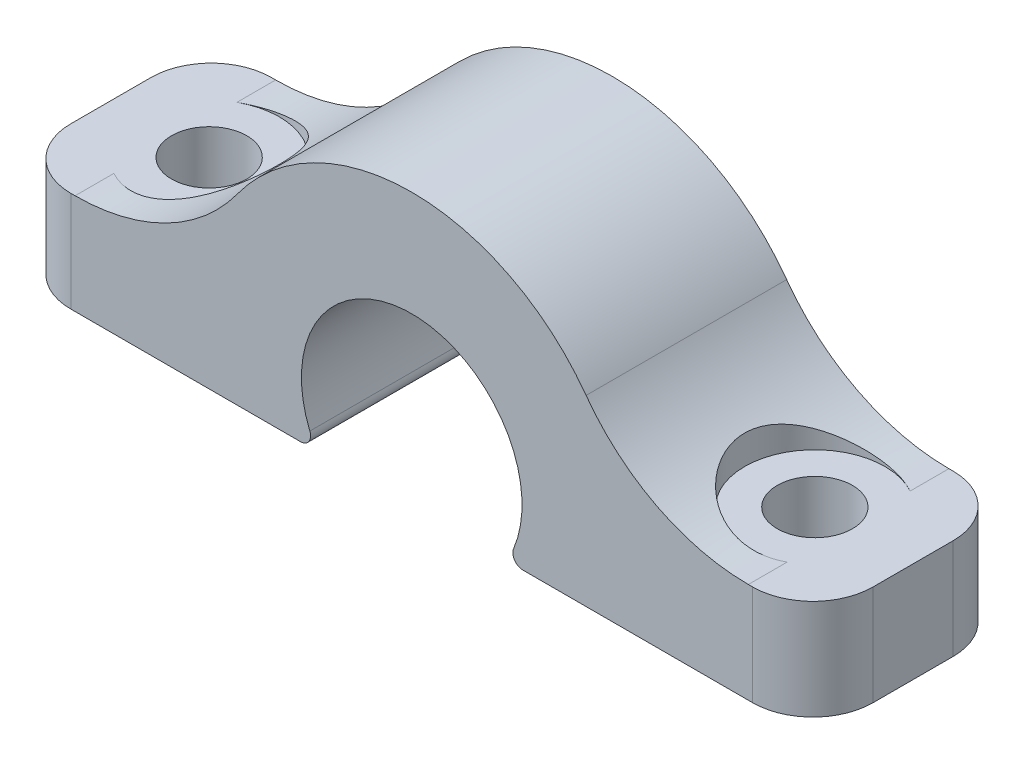
ISO-10303-21;
HEADER;
FILE_DESCRIPTION(('STEP AP214'),'2;1');
FILE_NAME('part.step','',(''),(''),'','','');
FILE_SCHEMA(('AUTOMOTIVE_DESIGN { 1 0 10303 214 1 1 1 1 }'));
ENDSEC;
DATA;
#1=APPLICATION_CONTEXT('core data for automotive mechanical design processes');
#2=APPLICATION_PROTOCOL_DEFINITION('international standard','automotive_design',2000,#1);
#3=PRODUCT_CONTEXT('',#1,'mechanical');
#4=PRODUCT('Part','Part','',(#3));
#5=PRODUCT_RELATED_PRODUCT_CATEGORY('part','',(#4));
#6=PRODUCT_DEFINITION_FORMATION('','',#4);
#7=PRODUCT_DEFINITION_CONTEXT('part definition',#1,'design');
#8=PRODUCT_DEFINITION('design','',#6,#7);
#9=PRODUCT_DEFINITION_SHAPE('','',#8);
#10=(LENGTH_UNIT() NAMED_UNIT(*) SI_UNIT(.MILLI.,.METRE.));
#11=(NAMED_UNIT(*) PLANE_ANGLE_UNIT() SI_UNIT($,.RADIAN.));
#12=(NAMED_UNIT(*) SI_UNIT($,.STERADIAN.) SOLID_ANGLE_UNIT());
#13=UNCERTAINTY_MEASURE_WITH_UNIT(LENGTH_MEASURE(1.E-05),#10,'distance_accuracy_value','');
#14=(GEOMETRIC_REPRESENTATION_CONTEXT(3) GLOBAL_UNCERTAINTY_ASSIGNED_CONTEXT((#13)) GLOBAL_UNIT_ASSIGNED_CONTEXT((#10,
#11,#12)) REPRESENTATION_CONTEXT('',''));
#15=CARTESIAN_POINT('',(0.,0.,0.));
#16=DIRECTION('',(0.,0.,1.));
#17=DIRECTION('',(1.,0.,0.));
#18=AXIS2_PLACEMENT_3D('',#15,#16,#17);
#19=CARTESIAN_POINT('',(16.7845911478356,15.,-5.));
#20=DIRECTION('',(0.,0.,1.));
#21=DIRECTION('',(1.,0.,0.));
#22=AXIS2_PLACEMENT_3D('',#19,#20,#21);
#23=CYLINDRICAL_SURFACE('',#22,10.);
#24=CARTESIAN_POINT('',(15.1,5.14291358135508,-3.5));
#25=CARTESIAN_POINT('',(14.9012420637391,5.17688479222685,-3.49999725385385));
#26=CARTESIAN_POINT('',(14.7035010704678,5.21692465445986,-3.48301079526282));
#27=CARTESIAN_POINT('',(14.3159783813763,5.30744431259501,-3.41672625102483));
#28=CARTESIAN_POINT('',(14.1262013235219,5.35793009313172,-3.36740960761945));
#29=CARTESIAN_POINT('',(13.7600779883335,5.46644439182743,-3.23915507273451));
#30=CARTESIAN_POINT('',(13.5836893492142,5.524447400026,-3.16031573129746));
#31=CARTESIAN_POINT('',(13.2473151107082,5.64480754116417,-2.97563318130559));
#32=CARTESIAN_POINT('',(13.0873328562993,5.7071655576753,-2.86978448129429));
#33=CARTESIAN_POINT('',(12.7778502746989,5.83616918616985,-2.62653217658595));
#34=CARTESIAN_POINT('',(12.6295496028122,5.90284812309209,-2.48761964016044));
#35=CARTESIAN_POINT('',(12.3581779950725,6.03175303369091,-2.18487609142455));
#36=CARTESIAN_POINT('',(12.2351179471765,6.09397707817443,-2.02103437836355));
#37=CARTESIAN_POINT('',(12.0721726979684,6.17974265598468,-1.7586897934134));
#38=CARTESIAN_POINT('',(12.021314147389,6.20715867488652,-1.66810310957423));
#39=CARTESIAN_POINT('',(11.9275435324674,6.25860754389224,-1.48201112812381));
#40=CARTESIAN_POINT('',(11.8846271663352,6.28264222375663,-1.38650852920133));
#41=CARTESIAN_POINT('',(11.8073076144251,6.32655614084001,-1.19129811710305));
#42=CARTESIAN_POINT('',(11.7728966997609,6.34643914810562,-1.09159421880781));
#43=CARTESIAN_POINT('',(11.7130567141673,6.38137235938249,-0.888703345355843));
#44=CARTESIAN_POINT('',(11.6876260115747,6.39642344128721,-0.785517006679166));
#45=CARTESIAN_POINT('',(11.6486626426931,6.41963357690376,-0.589120259399251));
#46=CARTESIAN_POINT('',(11.6340715543212,6.42840116090606,-0.496190657480308));
#47=CARTESIAN_POINT('',(11.6124097225005,6.44145454066032,-0.309152354409508));
#48=CARTESIAN_POINT('',(11.6053380505171,6.44574088977621,-0.215043800292935));
#49=CARTESIAN_POINT('',(11.5988306566801,6.44968389456414,-0.026502320312807));
#50=CARTESIAN_POINT('',(11.599391530412,6.44934261434045,0.0679304421512238));
#51=CARTESIAN_POINT('',(11.6081207922428,6.44405645573333,0.256285659811592));
#52=CARTESIAN_POINT('',(11.6162888109538,6.43911180088064,0.350208139563506));
#53=CARTESIAN_POINT('',(11.6496340359342,6.41903800847141,0.611101581716477));
#54=CARTESIAN_POINT('',(11.6831750005404,6.39893513188103,0.776711550030783));
#55=CARTESIAN_POINT('',(11.7729402857637,6.34632999168725,1.09945981921742));
#56=CARTESIAN_POINT('',(11.8291700850366,6.31382473339325,1.25659606354935));
#57=CARTESIAN_POINT('',(11.96579829081,6.23725677319021,1.56752277089644));
#58=CARTESIAN_POINT('',(12.0473294754787,6.19266847403355,1.72068369207618));
#59=CARTESIAN_POINT('',(12.2307891145007,6.0964271106687,2.01178474134867));
#60=CARTESIAN_POINT('',(12.3327273434435,6.04477066471859,2.14971752614186));
#61=CARTESIAN_POINT('',(12.5696152682538,5.93063081864443,2.42579792408162));
#62=CARTESIAN_POINT('',(12.7071558954737,5.86762299807373,2.56151170546682));
#63=CARTESIAN_POINT('',(13.0026025864841,5.7413613327689,2.80856568121129));
#64=CARTESIAN_POINT('',(13.160519533712,5.67810737420525,2.91989276375357));
#65=CARTESIAN_POINT('',(13.5056215301712,5.55095298588283,3.12262559518618));
#66=CARTESIAN_POINT('',(13.6940928056383,5.48733079810896,3.21203316834204));
#67=CARTESIAN_POINT('',(14.0863338416449,5.36873261373847,3.3565028045059));
#68=CARTESIAN_POINT('',(14.2900983418349,5.31375366411583,3.41157661705053));
#69=CARTESIAN_POINT('',(14.6976236774759,5.21805905940887,3.48265826986045));
#70=CARTESIAN_POINT('',(14.9009683338848,5.1768110045633,3.50031945858695));
#71=CARTESIAN_POINT('',(15.3097759696818,5.10718295130848,3.49967230072975));
#72=CARTESIAN_POINT('',(15.5152377319448,5.07879593978267,3.48138358671771));
#73=CARTESIAN_POINT('',(15.9053892996507,5.03694034568564,3.41138917444987));
#74=CARTESIAN_POINT('',(16.0904600873149,5.02249108333205,3.36236593629694));
#75=CARTESIAN_POINT('',(16.4505638121041,5.00395414227808,3.23457328615247));
#76=CARTESIAN_POINT('',(16.6255975992465,4.99986558487592,3.15580639740091));
#77=CARTESIAN_POINT('',(16.9572259396413,5.00013886838538,2.97253083984938));
#78=CARTESIAN_POINT('',(17.1141073270464,5.00434185566927,2.86853891007035));
#79=CARTESIAN_POINT('',(17.4090519140885,5.01842289996931,2.6369396503506));
#80=CARTESIAN_POINT('',(17.5471121757349,5.02830184175362,2.50932864076892));
#81=CARTESIAN_POINT('',(17.8049038277283,5.05131859697257,2.22952828150081));
#82=CARTESIAN_POINT('',(17.9239311553765,5.0645482555698,2.07669766208163));
#83=CARTESIAN_POINT('',(18.1352036040891,5.09105362429627,1.75351641448694));
#84=CARTESIAN_POINT('',(18.227445523329,5.10432933973918,1.58316369508049));
#85=CARTESIAN_POINT('',(18.3842992789479,5.12845492861904,1.22566963157149));
#86=CARTESIAN_POINT('',(18.448287235342,5.13924772352865,1.03824994558939));
#87=CARTESIAN_POINT('',(18.5438065263163,5.15583722744905,0.655108355132625));
#88=CARTESIAN_POINT('',(18.5753415794798,5.16163450885332,0.459387404526513));
#89=CARTESIAN_POINT('',(18.6047867600288,5.16703944019311,0.0676931291636535));
#90=CARTESIAN_POINT('',(18.6030927231972,5.16671995613543,-0.128249451668527));
#91=CARTESIAN_POINT('',(18.5671039757522,5.16013349158279,-0.517008619137269));
#92=CARTESIAN_POINT('',(18.5328095556477,5.15386656408674,-0.709825233614395));
#93=CARTESIAN_POINT('',(18.4330333588111,5.13667638640723,-1.08554975050366));
#94=CARTESIAN_POINT('',(18.3677674357776,5.12578541763986,-1.26851662036918));
#95=CARTESIAN_POINT('',(18.2080036275376,5.10149539647391,-1.62104101888454));
#96=CARTESIAN_POINT('',(18.1135018284116,5.08809600835846,-1.7905967483148));
#97=CARTESIAN_POINT('',(17.8961415160021,5.06135862025842,-2.11427878661829));
#98=CARTESIAN_POINT('',(17.7728701698111,5.04802471651285,-2.26812844532141));
#99=CARTESIAN_POINT('',(17.5021068217656,5.02485144534373,-2.55313783385616));
#100=CARTESIAN_POINT('',(17.3546143579614,5.01501214458124,-2.68429713083482));
#101=CARTESIAN_POINT('',(17.0397968669019,5.00202017116417,-2.91989011224531));
#102=CARTESIAN_POINT('',(16.872511589509,4.99885432909326,-3.02437607488125));
#103=CARTESIAN_POINT('',(16.5228791895133,5.00190076941156,-3.20374385032938));
#104=CARTESIAN_POINT('',(16.340539348984,5.00810854250365,-3.27863987589409));
#105=CARTESIAN_POINT('',(15.9825771005568,5.03073987010846,-3.39164146336757));
#106=CARTESIAN_POINT('',(15.8077112966898,5.04624551990401,-3.43234313354432));
#107=CARTESIAN_POINT('',(15.4549613693482,5.08719933509235,-3.48652431756053));
#108=CARTESIAN_POINT('',(15.2770770927939,5.11264800618847,-3.500002446592));
#109=CARTESIAN_POINT('',(15.1,5.14291358135508,-3.5));
#110=B_SPLINE_CURVE_WITH_KNOTS('',3,(#24,#25,#26,#27,#28,#29,#30,#31,#32,#33,#34,#35,#36,#37,
#38,#39,#40,#41,#42,#43,#44,#45,#46,#47,#48,#49,#50,#51,#52,#53,#54,#55,#56,#57,#58,#59,#60,#61,
#62,#63,#64,#65,#66,#67,#68,#69,#70,#71,#72,#73,#74,#75,#76,#77,#78,#79,#80,#81,#82,#83,#84,#85,
#86,#87,#88,#89,#90,#91,#92,#93,#94,#95,#96,#97,#98,#99,#100,#101,#102,#103,#104,#105,#106,#107,
#108,#109),.UNSPECIFIED.,.T.,.F.,(4,2,2,2,2,2,2,2,2,2,2,2,2,2,2,2,2,2,2,2,2,2,2,2,2,2,2,2,2,2,2,
2,2,2,2,2,2,2,2,2,2,2,4),(0.,0.60421533019431,1.20877778836537,1.81133988379051,
2.41402458796704,3.05276475444631,3.69177987516586,4.01373458093609,4.33551439008376,
4.65700071463068,4.97842859649591,5.26145890344385,5.54445425635052,5.82732338638012,
6.11017878156281,6.6181752364222,7.12629443028237,7.66161763794819,8.1971978714879,
8.80434004418247,9.41180785764659,10.0627887137993,10.713546671906,11.3348887568082,
11.9558916153675,12.5290615113764,13.1021827946431,13.66443052431,14.2267659209761,
14.8066004255892,15.3865042128757,15.9786406257699,16.5707091817534,17.1557291530445,
17.7407439111498,18.3217400249876,18.9028139526965,19.4928033499174,20.0828040008377,
20.6716392491298,21.2601913209471,21.7984704659766,22.3367769915179),.UNSPECIFIED.);
#111=CARTESIAN_POINT('',(16.7845911478356,5.,-3.06792318427859));
#112=VERTEX_POINT('',#111);
#113=CARTESIAN_POINT('',(16.7845911478356,5.,3.06792318427859));
#114=VERTEX_POINT('',#113);
#115=EDGE_CURVE('E11',#112,#114,#110,.T.);
#116=ORIENTED_EDGE('',*,*,#115,.F.);
#117=DIRECTION('',(0.,0.,1.));
#118=VECTOR('',#117,1.);
#119=CARTESIAN_POINT('',(16.7845911478356,5.,0.));
#120=LINE('',#119,#118);
#121=CARTESIAN_POINT('',(16.7845911478356,5.,-5.));
#122=VERTEX_POINT('',#121);
#123=EDGE_CURVE('E183',#122,#112,#120,.T.);
#124=ORIENTED_EDGE('',*,*,#123,.F.);
#125=CARTESIAN_POINT('',(16.7845911478356,15.,-5.));
#126=DIRECTION('',(0.,0.,-1.));
#127=DIRECTION('',(-1.,0.,0.));
#128=AXIS2_PLACEMENT_3D('',#125,#126,#127);
#129=CIRCLE('',#128,10.);
#130=CARTESIAN_POINT('',(8.69563155851722,9.12048192771084,-5.));
#131=VERTEX_POINT('',#130);
#132=EDGE_CURVE('E199',#131,#122,#129,.F.);
#133=ORIENTED_EDGE('',*,*,#132,.F.);
#134=DIRECTION('',(0.,0.,1.));
#135=VECTOR('',#134,1.);
#136=CARTESIAN_POINT('',(8.69563155851722,9.12048192771084,-5.));
#137=LINE('',#136,#135);
#138=CARTESIAN_POINT('',(8.69563155851722,9.12048192771084,5.));
#139=VERTEX_POINT('',#138);
#140=EDGE_CURVE('E189',#139,#131,#137,.F.);
#141=ORIENTED_EDGE('',*,*,#140,.F.);
#142=CARTESIAN_POINT('',(16.7845911478356,15.,5.));
#143=DIRECTION('',(0.,0.,-1.));
#144=DIRECTION('',(-1.,0.,0.));
#145=AXIS2_PLACEMENT_3D('',#142,#143,#144);
#146=CIRCLE('',#145,10.);
#147=CARTESIAN_POINT('',(16.7845911478356,5.,5.));
#148=VERTEX_POINT('',#147);
#149=EDGE_CURVE('E188',#148,#139,#146,.T.);
#150=ORIENTED_EDGE('',*,*,#149,.F.);
#151=EDGE_CURVE('E180',#114,#148,#120,.T.);
#152=ORIENTED_EDGE('',*,*,#151,.F.);
#153=EDGE_LOOP('',(#116,#124,#133,#141,#150,#152));
#154=FACE_BOUND('',#153,.T.);
#155=ADVANCED_FACE('F39',(#154),#23,.F.);
#156=CARTESIAN_POINT('',(-16.7845911478356,15.,-5.));
#157=DIRECTION('',(0.,0.,1.));
#158=DIRECTION('',(1.,0.,0.));
#159=AXIS2_PLACEMENT_3D('',#156,#157,#158);
#160=CYLINDRICAL_SURFACE('',#159,10.);
#161=CARTESIAN_POINT('',(-16.7845911478356,5.,3.06792318427858));
#162=CARTESIAN_POINT('',(-16.7020331853117,4.99999088376674,3.11326985319645));
#163=CARTESIAN_POINT('',(-16.6176303998867,5.00102194299124,3.15526372346956));
#164=CARTESIAN_POINT('',(-16.4457661702944,5.00537455977287,3.23229919844854));
#165=CARTESIAN_POINT('',(-16.3583046983036,5.00869613817094,3.2673407398929));
#166=CARTESIAN_POINT('',(-16.1811176362834,5.01783159463483,3.33016660377758));
#167=CARTESIAN_POINT('',(-16.0913964753172,5.02364090762044,3.35796406978927));
#168=CARTESIAN_POINT('',(-15.9102123409833,5.03788589638757,3.40622144460049));
#169=CARTESIAN_POINT('',(-15.8187494452382,5.04632145538307,3.42668167959089));
#170=CARTESIAN_POINT('',(-15.6346989866963,5.06590163988983,3.46018023471575));
#171=CARTESIAN_POINT('',(-15.5421107938317,5.07704785644057,3.47321418086291));
#172=CARTESIAN_POINT('',(-15.3565414029101,5.10204729512423,3.49183320730296));
#173=CARTESIAN_POINT('',(-15.2635600717849,5.11590152008108,3.49741552210947));
#174=CARTESIAN_POINT('',(-14.985130903437,5.16144669098825,3.50302348852884));
#175=CARTESIAN_POINT('',(-14.7999852985788,5.19714255846255,3.49194824058909));
#176=CARTESIAN_POINT('',(-14.4341482048413,5.27832525633425,3.4410962820769));
#177=CARTESIAN_POINT('',(-14.25351650015,5.32390274664387,3.40104519456981));
#178=CARTESIAN_POINT('',(-13.9025748588741,5.42256649842659,3.29391092744166));
#179=CARTESIAN_POINT('',(-13.7322699396367,5.47565636874473,3.22681472691182));
#180=CARTESIAN_POINT('',(-13.3940518892332,5.59051957519298,3.06227612014123));
#181=CARTESIAN_POINT('',(-13.2271252169865,5.65263985497969,2.96305066971409));
#182=CARTESIAN_POINT('',(-12.912246524425,5.77862526157832,2.73881728446098));
#183=CARTESIAN_POINT('',(-12.7643043336267,5.84249127167795,2.61379608013744));
#184=CARTESIAN_POINT('',(-12.4814590215828,5.97177822034772,2.33147477777679));
#185=CARTESIAN_POINT('',(-12.3480483065324,6.03702624077346,2.1725950024664));
#186=CARTESIAN_POINT('',(-12.1100773186805,6.15879879001092,1.83126297368931));
#187=CARTESIAN_POINT('',(-12.0055135574518,6.21532437325179,1.64881357439011));
#188=CARTESIAN_POINT('',(-11.8755038713601,6.28775611795541,1.36488963069493));
#189=CARTESIAN_POINT('',(-11.837184014806,6.30950396829916,1.27061787987907));
#190=CARTESIAN_POINT('',(-11.7686977194438,6.34885130216594,1.0783402550795));
#191=CARTESIAN_POINT('',(-11.7385266624903,6.36645313462308,0.980336532192277));
#192=CARTESIAN_POINT('',(-11.6868108631048,6.39688787137221,0.781466056190797));
#193=CARTESIAN_POINT('',(-11.6652571759457,6.4097257196232,0.680602388775173));
#194=CARTESIAN_POINT('',(-11.6310987387329,6.43017410141206,0.476850999272391));
#195=CARTESIAN_POINT('',(-11.6184924669602,6.43778552381967,0.373963624424869));
#196=CARTESIAN_POINT('',(-11.6035595020366,6.44681506790084,0.181412029505805));
#197=CARTESIAN_POINT('',(-11.6000600809731,6.44893943453165,0.0918695981558419));
#198=CARTESIAN_POINT('',(-11.5999414416652,6.44901127010956,-0.0872525395128893));
#199=CARTESIAN_POINT('',(-11.6033243772154,6.44695743151094,-0.176832248726481));
#200=CARTESIAN_POINT('',(-11.6169266184195,6.43873215449465,-0.355242783540674));
#201=CARTESIAN_POINT('',(-11.6271429470016,6.43256250919398,-0.444073918211025));
#202=CARTESIAN_POINT('',(-11.6542598501205,6.41629779141074,-0.620356800426145));
#203=CARTESIAN_POINT('',(-11.671163014479,6.4062011980407,-0.707807999857273));
#204=CARTESIAN_POINT('',(-11.7294916655942,6.37167563313908,-0.958069981274997));
#205=CARTESIAN_POINT('',(-11.7793304211273,6.34250312209958,-1.11835708888418));
#206=CARTESIAN_POINT('',(-11.9002915670753,6.27369416098187,-1.42814455586013));
#207=CARTESIAN_POINT('',(-11.9714199439976,6.23405476805227,-1.57764186650942));
#208=CARTESIAN_POINT('',(-12.14070827496,6.14311332896215,-1.87750945082549));
#209=CARTESIAN_POINT('',(-12.2408286621426,6.09105069184765,-2.02654148939239));
#210=CARTESIAN_POINT('',(-12.4615086835271,5.98190101155988,-2.30655271465655));
#211=CARTESIAN_POINT('',(-12.5820800522968,5.92481109287713,-2.43752145814748));
#212=CARTESIAN_POINT('',(-12.8576825712361,5.80190638605391,-2.69479222411853));
#213=CARTESIAN_POINT('',(-13.0151434785543,5.73590148062836,-2.8184080354702));
#214=CARTESIAN_POINT('',(-13.3497935077306,5.60669115759935,-3.0375540243465));
#215=CARTESIAN_POINT('',(-13.5269894922953,5.54348672458357,-3.13307438961176));
#216=CARTESIAN_POINT('',(-13.8071078382317,5.45302780891117,-3.2541076473036));
#217=CARTESIAN_POINT('',(-13.9043833691148,5.42320190476583,-3.29110802765112));
#218=CARTESIAN_POINT('',(-14.1024444288476,5.36585817898544,-3.35644759114004));
#219=CARTESIAN_POINT('',(-14.2032284040705,5.33833935366454,-3.38479055499324));
#220=CARTESIAN_POINT('',(-14.4075979033261,5.2860392138945,-3.43243226507626));
#221=CARTESIAN_POINT('',(-14.5111832608902,5.26125773722506,-3.45173154747126));
#222=CARTESIAN_POINT('',(-14.7203070198653,5.21479727225982,-3.480943905088));
#223=CARTESIAN_POINT('',(-14.8258443662475,5.19311666030185,-3.49086190788248));
#224=CARTESIAN_POINT('',(-15.0306507551745,5.15450410698574,-3.50070862291047));
#225=CARTESIAN_POINT('',(-15.129846658261,5.13734705985965,-3.50128267304036));
#226=CARTESIAN_POINT('',(-15.3283633740868,5.10608816839663,-3.49395339032789));
#227=CARTESIAN_POINT('',(-15.4276841053557,5.09198488007817,-3.4860540747161));
#228=CARTESIAN_POINT('',(-15.6256426087015,5.06688433758255,-3.4617393547002));
#229=CARTESIAN_POINT('',(-15.7242805940016,5.05588606665555,-3.44532674301404));
#230=CARTESIAN_POINT('',(-15.9200349998971,5.03695722591575,-3.40404932071229));
#231=CARTESIAN_POINT('',(-16.0171518700329,5.02902573270359,-3.3791870585092));
#232=CARTESIAN_POINT('',(-16.2294415541022,5.01474320686375,-3.31498196024197));
#233=CARTESIAN_POINT('',(-16.3440753276161,5.00908414948956,-3.27368629803798));
#234=CARTESIAN_POINT('',(-16.5683668592046,5.00170145918103,-3.17942591143158));
#235=CARTESIAN_POINT('',(-16.6780319543677,4.99997182496011,-3.12647911729703));
#236=CARTESIAN_POINT('',(-16.7845911478356,5.,-3.06792318427858));
#237=B_SPLINE_CURVE_WITH_KNOTS('',3,(#161,#162,#163,#164,#165,#166,#167,#168,#169,#170,#171,
#172,#173,#174,#175,#176,#177,#178,#179,#180,#181,#182,#183,#184,#185,#186,#187,#188,#189,#190,
#191,#192,#193,#194,#195,#196,#197,#198,#199,#200,#201,#202,#203,#204,#205,#206,#207,#208,#209,
#210,#211,#212,#213,#214,#215,#216,#217,#218,#219,#220,#221,#222,#223,#224,#225,#226,#227,#228,
#229,#230,#231,#232,#233,#234,#235,#236),.UNSPECIFIED.,.F.,.F.,(4,2,2,2,2,2,2,2,2,2,2,2,2,2,2,2,
2,2,2,2,2,2,2,2,2,2,2,2,2,2,2,2,2,2,2,2,2,4),(0.,0.282497951749595,0.56499847392209,
0.846982804300978,1.12895459696392,1.41109229611049,1.69333467451483,2.25717620745293,
2.82642791929438,3.39595402617647,4.00501003679853,4.61438013426184,5.26373232238101,
5.91300595067044,6.22480418441857,6.53642534110556,6.84772219370477,7.15896609024103,
7.42752246565104,7.69616289718937,7.96468636759573,8.23331393953245,8.74209785827184,
9.25102497846406,9.80961189270948,10.3685204095252,10.9981319824896,11.6279631852249,
11.9523997525063,12.2766944344317,12.6009698877365,12.9250749186971,13.2266927124719,
13.5281675721472,13.8295435979184,14.1308288092994,14.4960135772264,14.8606402337125),.UNSPECIFIED.);
#238=CARTESIAN_POINT('',(-16.7845911478356,5.,3.06792318427859));
#239=VERTEX_POINT('',#238);
#240=CARTESIAN_POINT('',(-16.7845911478356,5.,-3.06792318427859));
#241=VERTEX_POINT('',#240);
#242=EDGE_CURVE('E52',#239,#241,#237,.T.);
#243=ORIENTED_EDGE('',*,*,#242,.F.);
#244=DIRECTION('',(0.,0.,-1.));
#245=VECTOR('',#244,1.);
#246=CARTESIAN_POINT('',(-16.7845911478356,5.,-5.));
#247=LINE('',#246,#245);
#248=CARTESIAN_POINT('',(-16.7845911478356,5.,5.));
#249=VERTEX_POINT('',#248);
#250=EDGE_CURVE('E196',#249,#239,#247,.T.);
#251=ORIENTED_EDGE('',*,*,#250,.F.);
#252=CARTESIAN_POINT('',(-16.7845911478356,15.,5.));
#253=DIRECTION('',(0.,0.,-1.));
#254=DIRECTION('',(-1.,0.,0.));
#255=AXIS2_PLACEMENT_3D('',#252,#253,#254);
#256=CIRCLE('',#255,10.);
#257=CARTESIAN_POINT('',(-8.69563155851722,9.12048192771084,5.));
#258=VERTEX_POINT('',#257);
#259=EDGE_CURVE('E59',#258,#249,#256,.T.);
#260=ORIENTED_EDGE('',*,*,#259,.F.);
#261=DIRECTION('',(0.,0.,1.));
#262=VECTOR('',#261,1.);
#263=CARTESIAN_POINT('',(-8.69563155851722,9.12048192771084,-5.));
#264=LINE('',#263,#262);
#265=CARTESIAN_POINT('',(-8.69563155851722,9.12048192771084,-5.));
#266=VERTEX_POINT('',#265);
#267=EDGE_CURVE('E192',#266,#258,#264,.T.);
#268=ORIENTED_EDGE('',*,*,#267,.F.);
#269=CARTESIAN_POINT('',(-16.7845911478356,15.,-5.));
#270=DIRECTION('',(0.,0.,-1.));
#271=DIRECTION('',(-1.,0.,0.));
#272=AXIS2_PLACEMENT_3D('',#269,#270,#271);
#273=CIRCLE('',#272,10.);
#274=CARTESIAN_POINT('',(-16.7845911478356,5.,-5.));
#275=VERTEX_POINT('',#274);
#276=EDGE_CURVE('E202',#275,#266,#273,.F.);
#277=ORIENTED_EDGE('',*,*,#276,.F.);
#278=EDGE_CURVE('E67',#241,#275,#247,.T.);
#279=ORIENTED_EDGE('',*,*,#278,.F.);
#280=EDGE_LOOP('',(#243,#251,#260,#268,#277,#279));
#281=FACE_BOUND('',#280,.T.);
#282=ADVANCED_FACE('F41',(#281),#160,.F.);
#283=CARTESIAN_POINT('',(-15.1,-6.,0.));
#284=DIRECTION('',(0.,1.,0.));
#285=DIRECTION('',(0.,0.,1.));
#286=AXIS2_PLACEMENT_3D('',#283,#284,#285);
#287=CYLINDRICAL_SURFACE('',#286,1.875);
#288=CARTESIAN_POINT('',(-15.1,0.,0.));
#289=DIRECTION('',(0.,-1.,0.));
#290=DIRECTION('',(0.,0.,-1.));
#291=AXIS2_PLACEMENT_3D('',#288,#289,#290);
#292=CIRCLE('',#291,1.875);
#293=CARTESIAN_POINT('',(-15.1,0.,-1.875));
#294=VERTEX_POINT('',#293);
#295=EDGE_CURVE('E407',#294,#294,#292,.T.);
#296=ORIENTED_EDGE('',*,*,#295,.T.);
#297=EDGE_LOOP('',(#296));
#298=FACE_BOUND('',#297,.T.);
#299=CARTESIAN_POINT('',(-15.1,5.,0.));
#300=DIRECTION('',(0.,1.,0.));
#301=DIRECTION('',(0.,0.,1.));
#302=AXIS2_PLACEMENT_3D('',#299,#300,#301);
#303=CIRCLE('',#302,1.875);
#304=CARTESIAN_POINT('',(-15.1,5.,1.875));
#305=VERTEX_POINT('',#304);
#306=EDGE_CURVE('E412',#305,#305,#303,.T.);
#307=ORIENTED_EDGE('',*,*,#306,.T.);
#308=EDGE_LOOP('',(#307));
#309=FACE_BOUND('',#308,.T.);
#310=ADVANCED_FACE('F217',(#298,#309),#287,.F.);
#311=CARTESIAN_POINT('',(0.,2.8,-5.));
#312=DIRECTION('',(0.,0.,1.));
#313=DIRECTION('',(1.,0.,0.));
#314=AXIS2_PLACEMENT_3D('',#311,#312,#313);
#315=CYLINDRICAL_SURFACE('',#314,10.75);
#316=CARTESIAN_POINT('',(0.,2.8,5.));
#317=DIRECTION('',(0.,0.,1.));
#318=DIRECTION('',(-1.,0.,0.));
#319=AXIS2_PLACEMENT_3D('',#316,#317,#318);
#320=CIRCLE('',#319,10.75);
#321=EDGE_CURVE('E316',#139,#258,#320,.T.);
#322=ORIENTED_EDGE('',*,*,#321,.F.);
#323=ORIENTED_EDGE('',*,*,#140,.T.);
#324=CARTESIAN_POINT('',(0.,2.8,-5.));
#325=DIRECTION('',(0.,0.,1.));
#326=DIRECTION('',(-1.,0.,0.));
#327=AXIS2_PLACEMENT_3D('',#324,#325,#326);
#328=CIRCLE('',#327,10.75);
#329=EDGE_CURVE('E326',#131,#266,#328,.T.);
#330=ORIENTED_EDGE('',*,*,#329,.T.);
#331=ORIENTED_EDGE('',*,*,#267,.T.);
#332=EDGE_LOOP('',(#322,#323,#330,#331));
#333=FACE_BOUND('',#332,.T.);
#334=ADVANCED_FACE('F220',(#333),#315,.T.);
#335=CARTESIAN_POINT('',(0.,2.8,-5.));
#336=DIRECTION('',(0.,0.,1.));
#337=DIRECTION('',(1.,0.,0.));
#338=AXIS2_PLACEMENT_3D('',#335,#336,#337);
#339=CYLINDRICAL_SURFACE('',#338,5.5);
#340=CARTESIAN_POINT('',(0.,2.8,5.));
#341=DIRECTION('',(0.,0.,-1.));
#342=DIRECTION('',(-1.,0.,0.));
#343=AXIS2_PLACEMENT_3D('',#340,#341,#342);
#344=CIRCLE('',#343,5.5);
#345=CARTESIAN_POINT('',(-5.07985536758238,0.691666666666667,5.));
#346=VERTEX_POINT('',#345);
#347=CARTESIAN_POINT('',(5.07985536758238,0.691666666666667,5.));
#348=VERTEX_POINT('',#347);
#349=EDGE_CURVE('E303',#346,#348,#344,.T.);
#350=ORIENTED_EDGE('',*,*,#349,.F.);
#351=DIRECTION('',(0.,0.,1.));
#352=VECTOR('',#351,1.);
#353=CARTESIAN_POINT('',(-5.07985536758238,0.691666666666667,-5.));
#354=LINE('',#353,#352);
#355=CARTESIAN_POINT('',(-5.07985536758238,0.691666666666667,-5.));
#356=VERTEX_POINT('',#355);
#357=EDGE_CURVE('E379',#346,#356,#354,.F.);
#358=ORIENTED_EDGE('',*,*,#357,.T.);
#359=CARTESIAN_POINT('',(0.,2.8,-5.));
#360=DIRECTION('',(0.,0.,-1.));
#361=DIRECTION('',(-1.,0.,0.));
#362=AXIS2_PLACEMENT_3D('',#359,#360,#361);
#363=CIRCLE('',#362,5.5);
#364=CARTESIAN_POINT('',(5.07985536758238,0.691666666666667,-5.));
#365=VERTEX_POINT('',#364);
#366=EDGE_CURVE('E321',#356,#365,#363,.T.);
#367=ORIENTED_EDGE('',*,*,#366,.T.);
#368=DIRECTION('',(0.,0.,1.));
#369=VECTOR('',#368,1.);
#370=CARTESIAN_POINT('',(5.07985536758238,0.691666666666667,-5.));
#371=LINE('',#370,#369);
#372=EDGE_CURVE('E376',#365,#348,#371,.T.);
#373=ORIENTED_EDGE('',*,*,#372,.T.);
#374=EDGE_LOOP('',(#350,#358,#367,#373));
#375=FACE_BOUND('',#374,.T.);
#376=ADVANCED_FACE('F251',(#375),#339,.F.);
#377=CARTESIAN_POINT('',(-10.3789450330946,0.,-5.));
#378=DIRECTION('',(0.,-1.,0.));
#379=DIRECTION('',(0.,0.,-1.));
#380=AXIS2_PLACEMENT_3D('',#377,#378,#379);
#381=PLANE('',#380);
#382=ORIENTED_EDGE('',*,*,#295,.F.);
#383=EDGE_LOOP('',(#382));
#384=FACE_BOUND('',#383,.T.);
#385=DIRECTION('',(1.,0.,0.));
#386=VECTOR('',#385,1.);
#387=CARTESIAN_POINT('',(-10.3789450330946,0.,-5.));
#388=LINE('',#387,#386);
#389=CARTESIAN_POINT('',(-17.,0.,-5.));
#390=VERTEX_POINT('',#389);
#391=CARTESIAN_POINT('',(-5.54166040099896,0.,-5.));
#392=VERTEX_POINT('',#391);
#393=EDGE_CURVE('E329',#390,#392,#388,.T.);
#394=ORIENTED_EDGE('',*,*,#393,.T.);
#395=DIRECTION('',(0.,0.,1.));
#396=VECTOR('',#395,1.);
#397=CARTESIAN_POINT('',(-5.54166040099896,0.,-5.));
#398=LINE('',#397,#396);
#399=CARTESIAN_POINT('',(-5.54166040099896,0.,5.));
#400=VERTEX_POINT('',#399);
#401=EDGE_CURVE('E369',#392,#400,#398,.T.);
#402=ORIENTED_EDGE('',*,*,#401,.T.);
#403=DIRECTION('',(1.,0.,0.));
#404=VECTOR('',#403,1.);
#405=CARTESIAN_POINT('',(-10.3789450330946,0.,5.));
#406=LINE('',#405,#404);
#407=CARTESIAN_POINT('',(-17.,0.,5.));
#408=VERTEX_POINT('',#407);
#409=EDGE_CURVE('E318',#408,#400,#406,.T.);
#410=ORIENTED_EDGE('',*,*,#409,.F.);
#411=CARTESIAN_POINT('',(-17.,0.,2.));
#412=DIRECTION('',(0.,-1.,0.));
#413=DIRECTION('',(0.,0.,-1.));
#414=AXIS2_PLACEMENT_3D('',#411,#412,#413);
#415=CIRCLE('',#414,3.);
#416=CARTESIAN_POINT('',(-20.,0.,2.));
#417=VERTEX_POINT('',#416);
#418=EDGE_CURVE('E362',#408,#417,#415,.T.);
#419=ORIENTED_EDGE('',*,*,#418,.T.);
#420=DIRECTION('',(0.,0.,1.));
#421=VECTOR('',#420,1.);
#422=CARTESIAN_POINT('',(-20.,0.,-5.));
#423=LINE('',#422,#421);
#424=CARTESIAN_POINT('',(-20.,0.,-2.));
#425=VERTEX_POINT('',#424);
#426=EDGE_CURVE('E305',#425,#417,#423,.T.);
#427=ORIENTED_EDGE('',*,*,#426,.F.);
#428=CARTESIAN_POINT('',(-17.,0.,-2.));
#429=DIRECTION('',(0.,-1.,0.));
#430=DIRECTION('',(0.,0.,-1.));
#431=AXIS2_PLACEMENT_3D('',#428,#429,#430);
#432=CIRCLE('',#431,3.);
#433=EDGE_CURVE('E364',#425,#390,#432,.T.);
#434=ORIENTED_EDGE('',*,*,#433,.T.);
#435=EDGE_LOOP('',(#394,#402,#410,#419,#427,#434));
#436=FACE_BOUND('',#435,.T.);
#437=ADVANCED_FACE('F248',(#384,#436),#381,.T.);
#438=CARTESIAN_POINT('',(4.73392015141785,0.,-5.));
#439=DIRECTION('',(0.,-1.,0.));
#440=DIRECTION('',(0.,0.,-1.));
#441=AXIS2_PLACEMENT_3D('',#438,#439,#440);
#442=PLANE('',#441);
#443=CARTESIAN_POINT('',(15.1,0.,0.));
#444=DIRECTION('',(0.,-1.,0.));
#445=DIRECTION('',(0.,0.,-1.));
#446=AXIS2_PLACEMENT_3D('',#443,#444,#445);
#447=CIRCLE('',#446,1.875);
#448=CARTESIAN_POINT('',(15.1,0.,-1.875));
#449=VERTEX_POINT('',#448);
#450=EDGE_CURVE('E398',#449,#449,#447,.T.);
#451=ORIENTED_EDGE('',*,*,#450,.F.);
#452=EDGE_LOOP('',(#451));
#453=FACE_BOUND('',#452,.T.);
#454=DIRECTION('',(1.,0.,0.));
#455=VECTOR('',#454,1.);
#456=CARTESIAN_POINT('',(4.73392015141785,0.,5.));
#457=LINE('',#456,#455);
#458=CARTESIAN_POINT('',(5.54166040099896,0.,5.));
#459=VERTEX_POINT('',#458);
#460=CARTESIAN_POINT('',(17.,0.,5.));
#461=VERTEX_POINT('',#460);
#462=EDGE_CURVE('E314',#459,#461,#457,.T.);
#463=ORIENTED_EDGE('',*,*,#462,.F.);
#464=DIRECTION('',(0.,0.,1.));
#465=VECTOR('',#464,1.);
#466=CARTESIAN_POINT('',(5.54166040099896,0.,-5.));
#467=LINE('',#466,#465);
#468=CARTESIAN_POINT('',(5.54166040099896,0.,-5.));
#469=VERTEX_POINT('',#468);
#470=EDGE_CURVE('E385',#459,#469,#467,.F.);
#471=ORIENTED_EDGE('',*,*,#470,.T.);
#472=DIRECTION('',(1.,0.,0.));
#473=VECTOR('',#472,1.);
#474=CARTESIAN_POINT('',(4.73392015141785,0.,-5.));
#475=LINE('',#474,#473);
#476=CARTESIAN_POINT('',(17.,0.,-5.));
#477=VERTEX_POINT('',#476);
#478=EDGE_CURVE('E324',#469,#477,#475,.T.);
#479=ORIENTED_EDGE('',*,*,#478,.T.);
#480=CARTESIAN_POINT('',(17.,0.,-2.));
#481=DIRECTION('',(0.,-1.,0.));
#482=DIRECTION('',(0.,0.,-1.));
#483=AXIS2_PLACEMENT_3D('',#480,#481,#482);
#484=CIRCLE('',#483,3.);
#485=CARTESIAN_POINT('',(20.,0.,-2.));
#486=VERTEX_POINT('',#485);
#487=EDGE_CURVE('E341',#477,#486,#484,.T.);
#488=ORIENTED_EDGE('',*,*,#487,.T.);
#489=DIRECTION('',(0.,0.,-1.));
#490=VECTOR('',#489,1.);
#491=CARTESIAN_POINT('',(20.,0.,-5.));
#492=LINE('',#491,#490);
#493=CARTESIAN_POINT('',(20.,0.,2.));
#494=VERTEX_POINT('',#493);
#495=EDGE_CURVE('E396',#494,#486,#492,.T.);
#496=ORIENTED_EDGE('',*,*,#495,.F.);
#497=CARTESIAN_POINT('',(17.,0.,2.));
#498=DIRECTION('',(0.,-1.,0.));
#499=DIRECTION('',(0.,0.,-1.));
#500=AXIS2_PLACEMENT_3D('',#497,#498,#499);
#501=CIRCLE('',#500,3.);
#502=EDGE_CURVE('E338',#494,#461,#501,.T.);
#503=ORIENTED_EDGE('',*,*,#502,.T.);
#504=EDGE_LOOP('',(#463,#471,#479,#488,#496,#503));
#505=FACE_BOUND('',#504,.T.);
#506=ADVANCED_FACE('F246',(#453,#505),#442,.T.);
#507=CARTESIAN_POINT('',(0.,2.8,-5.));
#508=DIRECTION('',(0.,0.,-1.));
#509=DIRECTION('',(-1.,0.,0.));
#510=AXIS2_PLACEMENT_3D('',#507,#508,#509);
#511=PLANE('',#510);
#512=ORIENTED_EDGE('',*,*,#366,.F.);
#513=CARTESIAN_POINT('',(-5.54166040099896,0.5,-5.));
#514=DIRECTION('',(0.,0.,-1.));
#515=DIRECTION('',(-1.,0.,0.));
#516=AXIS2_PLACEMENT_3D('',#513,#514,#515);
#517=CIRCLE('',#516,0.5);
#518=EDGE_CURVE('E383',#356,#392,#517,.T.);
#519=ORIENTED_EDGE('',*,*,#518,.T.);
#520=ORIENTED_EDGE('',*,*,#393,.F.);
#521=DIRECTION('',(0.,-1.,0.));
#522=VECTOR('',#521,1.);
#523=CARTESIAN_POINT('',(-17.,5.,-5.));
#524=LINE('',#523,#522);
#525=CARTESIAN_POINT('',(-17.,5.,-5.));
#526=VERTEX_POINT('',#525);
#527=EDGE_CURVE('E332',#390,#526,#524,.F.);
#528=ORIENTED_EDGE('',*,*,#527,.T.);
#529=DIRECTION('',(-1.,0.,0.));
#530=VECTOR('',#529,1.);
#531=CARTESIAN_POINT('',(-20.,5.,-5.));
#532=LINE('',#531,#530);
#533=EDGE_CURVE('E300',#275,#526,#532,.T.);
#534=ORIENTED_EDGE('',*,*,#533,.F.);
#535=ORIENTED_EDGE('',*,*,#276,.T.);
#536=ORIENTED_EDGE('',*,*,#329,.F.);
#537=ORIENTED_EDGE('',*,*,#132,.T.);
#538=DIRECTION('',(-1.,0.,0.));
#539=VECTOR('',#538,1.);
#540=CARTESIAN_POINT('',(20.,5.,-5.));
#541=LINE('',#540,#539);
#542=CARTESIAN_POINT('',(17.,5.,-5.));
#543=VERTEX_POINT('',#542);
#544=EDGE_CURVE('E391',#543,#122,#541,.T.);
#545=ORIENTED_EDGE('',*,*,#544,.F.);
#546=DIRECTION('',(0.,-1.,0.));
#547=VECTOR('',#546,1.);
#548=CARTESIAN_POINT('',(17.,0.,-5.));
#549=LINE('',#548,#547);
#550=EDGE_CURVE('E335',#543,#477,#549,.T.);
#551=ORIENTED_EDGE('',*,*,#550,.T.);
#552=ORIENTED_EDGE('',*,*,#478,.F.);
#553=CARTESIAN_POINT('',(5.54166040099896,0.5,-5.));
#554=DIRECTION('',(0.,0.,-1.));
#555=DIRECTION('',(-1.,0.,0.));
#556=AXIS2_PLACEMENT_3D('',#553,#554,#555);
#557=CIRCLE('',#556,0.5);
#558=EDGE_CURVE('E381',#469,#365,#557,.T.);
#559=ORIENTED_EDGE('',*,*,#558,.T.);
#560=EDGE_LOOP('',(#512,#519,#520,#528,#534,#535,#536,#537,#545,#551,#552,#559));
#561=FACE_BOUND('',#560,.T.);
#562=ADVANCED_FACE('F243',(#561),#511,.T.);
#563=CARTESIAN_POINT('',(0.,2.8,5.));
#564=DIRECTION('',(0.,0.,-1.));
#565=DIRECTION('',(-1.,0.,0.));
#566=AXIS2_PLACEMENT_3D('',#563,#564,#565);
#567=PLANE('',#566);
#568=ORIENTED_EDGE('',*,*,#409,.T.);
#569=CARTESIAN_POINT('',(-5.54166040099896,0.5,5.));
#570=DIRECTION('',(0.,0.,-1.));
#571=DIRECTION('',(-1.,0.,0.));
#572=AXIS2_PLACEMENT_3D('',#569,#570,#571);
#573=CIRCLE('',#572,0.5);
#574=EDGE_CURVE('E374',#400,#346,#573,.F.);
#575=ORIENTED_EDGE('',*,*,#574,.T.);
#576=ORIENTED_EDGE('',*,*,#349,.T.);
#577=CARTESIAN_POINT('',(5.54166040099896,0.5,5.));
#578=DIRECTION('',(0.,0.,-1.));
#579=DIRECTION('',(-1.,0.,0.));
#580=AXIS2_PLACEMENT_3D('',#577,#578,#579);
#581=CIRCLE('',#580,0.5);
#582=EDGE_CURVE('E372',#348,#459,#581,.F.);
#583=ORIENTED_EDGE('',*,*,#582,.T.);
#584=ORIENTED_EDGE('',*,*,#462,.T.);
#585=DIRECTION('',(0.,-1.,0.));
#586=VECTOR('',#585,1.);
#587=CARTESIAN_POINT('',(17.,2.8,5.));
#588=LINE('',#587,#586);
#589=CARTESIAN_POINT('',(17.,5.,5.));
#590=VERTEX_POINT('',#589);
#591=EDGE_CURVE('E354',#461,#590,#588,.F.);
#592=ORIENTED_EDGE('',*,*,#591,.T.);
#593=DIRECTION('',(1.,0.,0.));
#594=VECTOR('',#593,1.);
#595=CARTESIAN_POINT('',(20.,5.,5.));
#596=LINE('',#595,#594);
#597=EDGE_CURVE('E311',#148,#590,#596,.T.);
#598=ORIENTED_EDGE('',*,*,#597,.F.);
#599=ORIENTED_EDGE('',*,*,#149,.T.);
#600=ORIENTED_EDGE('',*,*,#321,.T.);
#601=ORIENTED_EDGE('',*,*,#259,.T.);
#602=DIRECTION('',(1.,0.,0.));
#603=VECTOR('',#602,1.);
#604=CARTESIAN_POINT('',(-20.,5.,5.));
#605=LINE('',#604,#603);
#606=CARTESIAN_POINT('',(-17.,5.,5.));
#607=VERTEX_POINT('',#606);
#608=EDGE_CURVE('E294',#607,#249,#605,.T.);
#609=ORIENTED_EDGE('',*,*,#608,.F.);
#610=DIRECTION('',(0.,-1.,0.));
#611=VECTOR('',#610,1.);
#612=CARTESIAN_POINT('',(-17.,2.8,5.));
#613=LINE('',#612,#611);
#614=EDGE_CURVE('E352',#607,#408,#613,.T.);
#615=ORIENTED_EDGE('',*,*,#614,.T.);
#616=EDGE_LOOP('',(#568,#575,#576,#583,#584,#592,#598,#599,#600,#601,#609,#615));
#617=FACE_BOUND('',#616,.T.);
#618=ADVANCED_FACE('F239',(#617),#567,.F.);
#619=CARTESIAN_POINT('',(-20.,5.,-5.));
#620=DIRECTION('',(1.,0.,0.));
#621=DIRECTION('',(0.,0.,-1.));
#622=AXIS2_PLACEMENT_3D('',#619,#620,#621);
#623=PLANE('',#622);
#624=DIRECTION('',(0.,0.,1.));
#625=VECTOR('',#624,1.);
#626=CARTESIAN_POINT('',(-20.,5.,-5.));
#627=LINE('',#626,#625);
#628=CARTESIAN_POINT('',(-20.,5.,-2.));
#629=VERTEX_POINT('',#628);
#630=CARTESIAN_POINT('',(-20.,5.,2.));
#631=VERTEX_POINT('',#630);
#632=EDGE_CURVE('E301',#629,#631,#627,.T.);
#633=ORIENTED_EDGE('',*,*,#632,.F.);
#634=DIRECTION('',(0.,-1.,0.));
#635=VECTOR('',#634,1.);
#636=CARTESIAN_POINT('',(-20.,0.,-2.));
#637=LINE('',#636,#635);
#638=EDGE_CURVE('E359',#629,#425,#637,.T.);
#639=ORIENTED_EDGE('',*,*,#638,.T.);
#640=ORIENTED_EDGE('',*,*,#426,.T.);
#641=DIRECTION('',(0.,-1.,0.));
#642=VECTOR('',#641,1.);
#643=CARTESIAN_POINT('',(-20.,5.,2.));
#644=LINE('',#643,#642);
#645=EDGE_CURVE('E357',#417,#631,#644,.F.);
#646=ORIENTED_EDGE('',*,*,#645,.T.);
#647=EDGE_LOOP('',(#633,#639,#640,#646));
#648=FACE_BOUND('',#647,.T.);
#649=ADVANCED_FACE('F236',(#648),#623,.F.);
#650=CARTESIAN_POINT('',(0.,5.,0.));
#651=DIRECTION('',(0.,1.,0.));
#652=DIRECTION('',(0.,0.,1.));
#653=AXIS2_PLACEMENT_3D('',#650,#651,#652);
#654=PLANE('',#653);
#655=ORIENTED_EDGE('',*,*,#250,.T.);
#656=CARTESIAN_POINT('',(-15.1,5.,0.));
#657=DIRECTION('',(0.,1.,0.));
#658=DIRECTION('',(0.,0.,1.));
#659=AXIS2_PLACEMENT_3D('',#656,#657,#658);
#660=CIRCLE('',#659,3.5);
#661=EDGE_CURVE('E184',#239,#241,#660,.T.);
#662=ORIENTED_EDGE('',*,*,#661,.T.);
#663=ORIENTED_EDGE('',*,*,#278,.T.);
#664=ORIENTED_EDGE('',*,*,#533,.T.);
#665=CARTESIAN_POINT('',(-17.,5.,-2.));
#666=DIRECTION('',(0.,1.,0.));
#667=DIRECTION('',(0.,0.,1.));
#668=AXIS2_PLACEMENT_3D('',#665,#666,#667);
#669=CIRCLE('',#668,3.);
#670=EDGE_CURVE('E367',#526,#629,#669,.T.);
#671=ORIENTED_EDGE('',*,*,#670,.T.);
#672=ORIENTED_EDGE('',*,*,#632,.T.);
#673=CARTESIAN_POINT('',(-17.,5.,2.));
#674=DIRECTION('',(0.,1.,0.));
#675=DIRECTION('',(0.,0.,1.));
#676=AXIS2_PLACEMENT_3D('',#673,#674,#675);
#677=CIRCLE('',#676,3.);
#678=EDGE_CURVE('E297',#631,#607,#677,.T.);
#679=ORIENTED_EDGE('',*,*,#678,.T.);
#680=ORIENTED_EDGE('',*,*,#608,.T.);
#681=EDGE_LOOP('',(#655,#662,#663,#664,#671,#672,#679,#680));
#682=FACE_BOUND('',#681,.T.);
#683=ORIENTED_EDGE('',*,*,#306,.F.);
#684=EDGE_LOOP('',(#683));
#685=FACE_BOUND('',#684,.T.);
#686=ADVANCED_FACE('F232',(#682,#685),#654,.T.);
#687=CARTESIAN_POINT('',(20.,5.,-5.));
#688=DIRECTION('',(-1.,0.,0.));
#689=DIRECTION('',(0.,0.,1.));
#690=AXIS2_PLACEMENT_3D('',#687,#688,#689);
#691=PLANE('',#690);
#692=ORIENTED_EDGE('',*,*,#495,.T.);
#693=DIRECTION('',(0.,-1.,0.));
#694=VECTOR('',#693,1.);
#695=CARTESIAN_POINT('',(20.,5.,-2.));
#696=LINE('',#695,#694);
#697=CARTESIAN_POINT('',(20.,5.,-2.));
#698=VERTEX_POINT('',#697);
#699=EDGE_CURVE('E346',#486,#698,#696,.F.);
#700=ORIENTED_EDGE('',*,*,#699,.T.);
#701=DIRECTION('',(0.,0.,-1.));
#702=VECTOR('',#701,1.);
#703=CARTESIAN_POINT('',(20.,5.,-5.));
#704=LINE('',#703,#702);
#705=CARTESIAN_POINT('',(20.,5.,2.));
#706=VERTEX_POINT('',#705);
#707=EDGE_CURVE('E393',#706,#698,#704,.T.);
#708=ORIENTED_EDGE('',*,*,#707,.F.);
#709=DIRECTION('',(0.,-1.,0.));
#710=VECTOR('',#709,1.);
#711=CARTESIAN_POINT('',(20.,5.,2.));
#712=LINE('',#711,#710);
#713=EDGE_CURVE('E343',#706,#494,#712,.T.);
#714=ORIENTED_EDGE('',*,*,#713,.T.);
#715=EDGE_LOOP('',(#692,#700,#708,#714));
#716=FACE_BOUND('',#715,.T.);
#717=ADVANCED_FACE('F229',(#716),#691,.F.);
#718=CARTESIAN_POINT('',(0.,5.,0.));
#719=DIRECTION('',(0.,-1.,0.));
#720=DIRECTION('',(0.,0.,-1.));
#721=AXIS2_PLACEMENT_3D('',#718,#719,#720);
#722=PLANE('',#721);
#723=ORIENTED_EDGE('',*,*,#123,.T.);
#724=CARTESIAN_POINT('',(15.1,5.,0.));
#725=DIRECTION('',(0.,1.,0.));
#726=DIRECTION('',(0.,0.,-1.));
#727=AXIS2_PLACEMENT_3D('',#724,#725,#726);
#728=CIRCLE('',#727,3.5);
#729=EDGE_CURVE('E172',#112,#114,#728,.T.);
#730=ORIENTED_EDGE('',*,*,#729,.T.);
#731=ORIENTED_EDGE('',*,*,#151,.T.);
#732=ORIENTED_EDGE('',*,*,#597,.T.);
#733=CARTESIAN_POINT('',(17.,5.,2.));
#734=DIRECTION('',(0.,-1.,0.));
#735=DIRECTION('',(0.,0.,-1.));
#736=AXIS2_PLACEMENT_3D('',#733,#734,#735);
#737=CIRCLE('',#736,3.);
#738=EDGE_CURVE('E348',#590,#706,#737,.F.);
#739=ORIENTED_EDGE('',*,*,#738,.T.);
#740=ORIENTED_EDGE('',*,*,#707,.T.);
#741=CARTESIAN_POINT('',(17.,5.,-2.));
#742=DIRECTION('',(0.,-1.,0.));
#743=DIRECTION('',(0.,0.,-1.));
#744=AXIS2_PLACEMENT_3D('',#741,#742,#743);
#745=CIRCLE('',#744,3.);
#746=EDGE_CURVE('E350',#698,#543,#745,.F.);
#747=ORIENTED_EDGE('',*,*,#746,.T.);
#748=ORIENTED_EDGE('',*,*,#544,.T.);
#749=EDGE_LOOP('',(#723,#730,#731,#732,#739,#740,#747,#748));
#750=FACE_BOUND('',#749,.T.);
#751=CARTESIAN_POINT('',(15.1,5.,0.));
#752=DIRECTION('',(0.,-1.,0.));
#753=DIRECTION('',(0.,0.,-1.));
#754=AXIS2_PLACEMENT_3D('',#751,#752,#753);
#755=CIRCLE('',#754,1.875);
#756=CARTESIAN_POINT('',(15.1,5.,-1.875));
#757=VERTEX_POINT('',#756);
#758=EDGE_CURVE('E403',#757,#757,#755,.T.);
#759=ORIENTED_EDGE('',*,*,#758,.T.);
#760=EDGE_LOOP('',(#759));
#761=FACE_BOUND('',#760,.T.);
#762=ADVANCED_FACE('F178',(#750,#761),#722,.F.);
#763=CARTESIAN_POINT('',(17.,2.8,-2.));
#764=DIRECTION('',(0.,1.,0.));
#765=DIRECTION('',(0.,0.,1.));
#766=AXIS2_PLACEMENT_3D('',#763,#764,#765);
#767=CYLINDRICAL_SURFACE('',#766,3.);
#768=ORIENTED_EDGE('',*,*,#746,.F.);
#769=ORIENTED_EDGE('',*,*,#699,.F.);
#770=ORIENTED_EDGE('',*,*,#487,.F.);
#771=ORIENTED_EDGE('',*,*,#550,.F.);
#772=EDGE_LOOP('',(#768,#769,#770,#771));
#773=FACE_BOUND('',#772,.T.);
#774=ADVANCED_FACE('F228',(#773),#767,.T.);
#775=CARTESIAN_POINT('',(17.,5.,2.));
#776=DIRECTION('',(0.,-1.,0.));
#777=DIRECTION('',(0.,0.,-1.));
#778=AXIS2_PLACEMENT_3D('',#775,#776,#777);
#779=CYLINDRICAL_SURFACE('',#778,3.);
#780=ORIENTED_EDGE('',*,*,#738,.F.);
#781=ORIENTED_EDGE('',*,*,#591,.F.);
#782=ORIENTED_EDGE('',*,*,#502,.F.);
#783=ORIENTED_EDGE('',*,*,#713,.F.);
#784=EDGE_LOOP('',(#780,#781,#782,#783));
#785=FACE_BOUND('',#784,.T.);
#786=ADVANCED_FACE('F264',(#785),#779,.T.);
#787=CARTESIAN_POINT('',(-17.,5.,-2.));
#788=DIRECTION('',(0.,1.,0.));
#789=DIRECTION('',(0.,0.,1.));
#790=AXIS2_PLACEMENT_3D('',#787,#788,#789);
#791=CYLINDRICAL_SURFACE('',#790,3.);
#792=ORIENTED_EDGE('',*,*,#670,.F.);
#793=ORIENTED_EDGE('',*,*,#527,.F.);
#794=ORIENTED_EDGE('',*,*,#433,.F.);
#795=ORIENTED_EDGE('',*,*,#638,.F.);
#796=EDGE_LOOP('',(#792,#793,#794,#795));
#797=FACE_BOUND('',#796,.T.);
#798=ADVANCED_FACE('F268',(#797),#791,.T.);
#799=CARTESIAN_POINT('',(-17.,2.8,2.));
#800=DIRECTION('',(0.,-1.,0.));
#801=DIRECTION('',(0.,0.,-1.));
#802=AXIS2_PLACEMENT_3D('',#799,#800,#801);
#803=CYLINDRICAL_SURFACE('',#802,3.);
#804=ORIENTED_EDGE('',*,*,#678,.F.);
#805=ORIENTED_EDGE('',*,*,#645,.F.);
#806=ORIENTED_EDGE('',*,*,#418,.F.);
#807=ORIENTED_EDGE('',*,*,#614,.F.);
#808=EDGE_LOOP('',(#804,#805,#806,#807));
#809=FACE_BOUND('',#808,.T.);
#810=ADVANCED_FACE('F272',(#809),#803,.T.);
#811=CARTESIAN_POINT('',(-5.54166040099896,0.5,-5.));
#812=DIRECTION('',(0.,0.,1.));
#813=DIRECTION('',(1.,0.,0.));
#814=AXIS2_PLACEMENT_3D('',#811,#812,#813);
#815=CYLINDRICAL_SURFACE('',#814,0.5);
#816=ORIENTED_EDGE('',*,*,#518,.F.);
#817=ORIENTED_EDGE('',*,*,#357,.F.);
#818=ORIENTED_EDGE('',*,*,#574,.F.);
#819=ORIENTED_EDGE('',*,*,#401,.F.);
#820=EDGE_LOOP('',(#816,#817,#818,#819));
#821=FACE_BOUND('',#820,.T.);
#822=ADVANCED_FACE('F276',(#821),#815,.T.);
#823=CARTESIAN_POINT('',(5.54166040099896,0.5,-5.));
#824=DIRECTION('',(0.,0.,1.));
#825=DIRECTION('',(1.,0.,0.));
#826=AXIS2_PLACEMENT_3D('',#823,#824,#825);
#827=CYLINDRICAL_SURFACE('',#826,0.5);
#828=ORIENTED_EDGE('',*,*,#558,.F.);
#829=ORIENTED_EDGE('',*,*,#470,.F.);
#830=ORIENTED_EDGE('',*,*,#582,.F.);
#831=ORIENTED_EDGE('',*,*,#372,.F.);
#832=EDGE_LOOP('',(#828,#829,#830,#831));
#833=FACE_BOUND('',#832,.T.);
#834=ADVANCED_FACE('F224',(#833),#827,.T.);
#835=CARTESIAN_POINT('',(15.1,-6.,0.));
#836=DIRECTION('',(0.,1.,0.));
#837=DIRECTION('',(0.,0.,1.));
#838=AXIS2_PLACEMENT_3D('',#835,#836,#837);
#839=CYLINDRICAL_SURFACE('',#838,1.875);
#840=ORIENTED_EDGE('',*,*,#450,.T.);
#841=EDGE_LOOP('',(#840));
#842=FACE_BOUND('',#841,.T.);
#843=ORIENTED_EDGE('',*,*,#758,.F.);
#844=EDGE_LOOP('',(#843));
#845=FACE_BOUND('',#844,.T.);
#846=ADVANCED_FACE('F216',(#842,#845),#839,.F.);
#847=CARTESIAN_POINT('',(15.1,15.,0.));
#848=DIRECTION('',(0.,-1.,0.));
#849=DIRECTION('',(0.,0.,-1.));
#850=AXIS2_PLACEMENT_3D('',#847,#848,#849);
#851=CYLINDRICAL_SURFACE('',#850,3.5);
#852=ORIENTED_EDGE('',*,*,#115,.T.);
#853=ORIENTED_EDGE('',*,*,#729,.F.);
#854=EDGE_LOOP('',(#852,#853));
#855=FACE_BOUND('',#854,.T.);
#856=ADVANCED_FACE('F171',(#855),#851,.F.);
#857=CARTESIAN_POINT('',(-15.1,15.,0.));
#858=DIRECTION('',(0.,-1.,0.));
#859=DIRECTION('',(0.,0.,-1.));
#860=AXIS2_PLACEMENT_3D('',#857,#858,#859);
#861=CYLINDRICAL_SURFACE('',#860,3.5);
#862=ORIENTED_EDGE('',*,*,#242,.T.);
#863=ORIENTED_EDGE('',*,*,#661,.F.);
#864=EDGE_LOOP('',(#862,#863));
#865=FACE_BOUND('',#864,.T.);
#866=ADVANCED_FACE('F209',(#865),#861,.F.);
#867=CLOSED_SHELL('',(#155,#282,#310,#334,#376,#437,#506,#562,#618,#649,#686,#717,#762,#774,
#786,#798,#810,#822,#834,#846,#856,#866));
#868=MANIFOLD_SOLID_BREP('B2',#867);
#869=ADVANCED_BREP_SHAPE_REPRESENTATION('',(#18,#868),#14);
#870=SHAPE_DEFINITION_REPRESENTATION(#9,#869);
ENDSEC;
END-ISO-10303-21;
